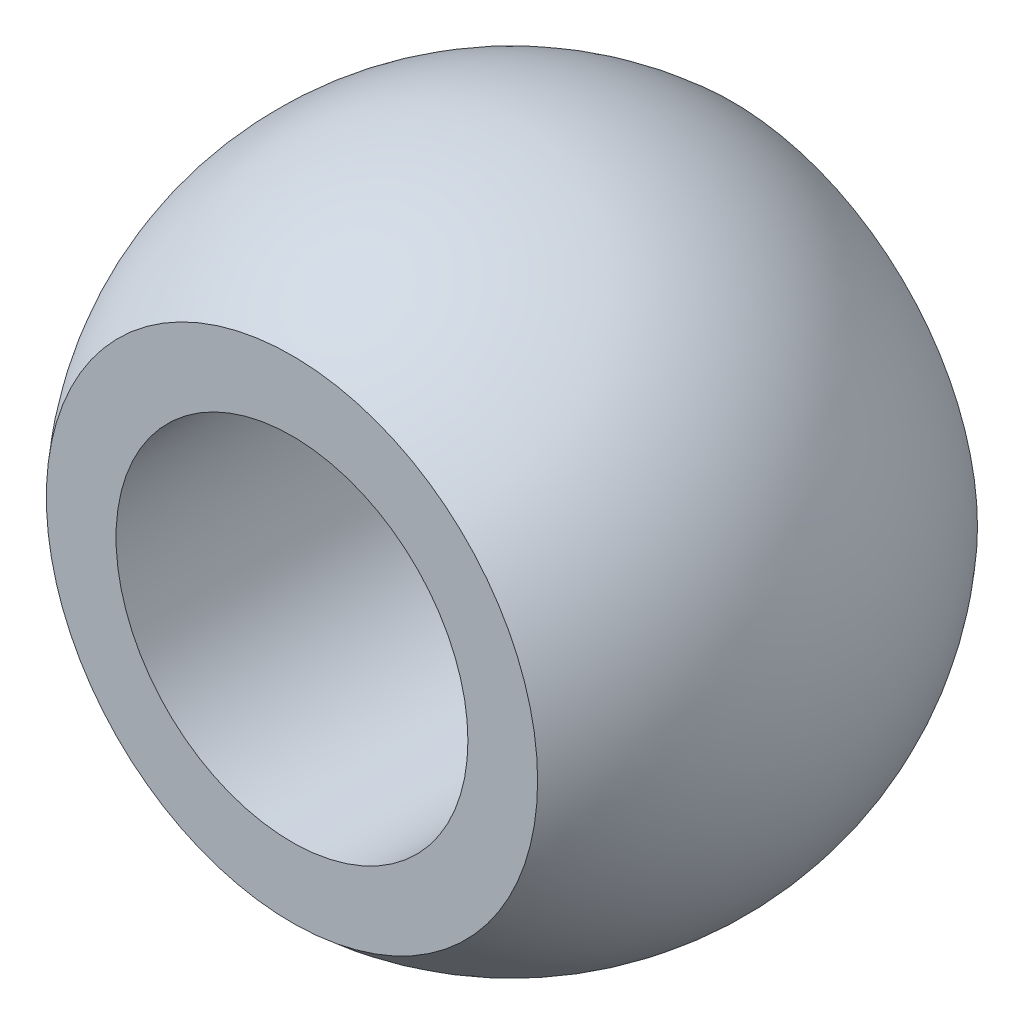
ISO-10303-21;
HEADER;
FILE_DESCRIPTION(('STEP AP214'),'2;1');
FILE_NAME('part.step','',(''),(''),'','','');
FILE_SCHEMA(('AUTOMOTIVE_DESIGN { 1 0 10303 214 1 1 1 1 }'));
ENDSEC;
DATA;
#1=APPLICATION_CONTEXT('core data for automotive mechanical design processes');
#2=APPLICATION_PROTOCOL_DEFINITION('international standard','automotive_design',2000,#1);
#3=PRODUCT_CONTEXT('',#1,'mechanical');
#4=PRODUCT('Part','Part','',(#3));
#5=PRODUCT_RELATED_PRODUCT_CATEGORY('part','',(#4));
#6=PRODUCT_DEFINITION_FORMATION('','',#4);
#7=PRODUCT_DEFINITION_CONTEXT('part definition',#1,'design');
#8=PRODUCT_DEFINITION('design','',#6,#7);
#9=PRODUCT_DEFINITION_SHAPE('','',#8);
#10=(LENGTH_UNIT() NAMED_UNIT(*) SI_UNIT(.MILLI.,.METRE.));
#11=(NAMED_UNIT(*) PLANE_ANGLE_UNIT() SI_UNIT($,.RADIAN.));
#12=(NAMED_UNIT(*) SI_UNIT($,.STERADIAN.) SOLID_ANGLE_UNIT());
#13=UNCERTAINTY_MEASURE_WITH_UNIT(LENGTH_MEASURE(1.E-05),#10,'distance_accuracy_value','');
#14=(GEOMETRIC_REPRESENTATION_CONTEXT(3) GLOBAL_UNCERTAINTY_ASSIGNED_CONTEXT((#13)) GLOBAL_UNIT_ASSIGNED_CONTEXT((#10,
#11,#12)) REPRESENTATION_CONTEXT('',''));
#15=CARTESIAN_POINT('',(0.,0.,0.));
#16=DIRECTION('',(0.,0.,1.));
#17=DIRECTION('',(1.,0.,0.));
#18=AXIS2_PLACEMENT_3D('',#15,#16,#17);
#19=CARTESIAN_POINT('',(0.,0.,0.));
#20=DIRECTION('',(0.,-1.,0.));
#21=DIRECTION('',(-1.,0.,0.));
#22=AXIS2_PLACEMENT_3D('',#19,#20,#21);
#23=SPHERICAL_SURFACE('',#22,11.8999);
#24=CARTESIAN_POINT('',(0.,0.,0.));
#25=DIRECTION('',(0.,0.,1.));
#26=DIRECTION('',(1.,0.,0.));
#27=AXIS2_PLACEMENT_3D('',#24,#25,#26);
#28=SPHERICAL_SURFACE('',#27,11.8999);
#29=CARTESIAN_POINT('',(0.,0.,7.9375));
#30=DIRECTION('',(0.,0.,1.));
#31=DIRECTION('',(1.,0.,0.));
#32=AXIS2_PLACEMENT_3D('',#29,#30,#31);
#33=CIRCLE('',#32,8.86587354748532);
#34=CARTESIAN_POINT('',(8.86587354748532,0.,7.9375));
#35=VERTEX_POINT('',#34);
#36=EDGE_CURVE('E10',#35,#35,#33,.T.);
#37=ORIENTED_EDGE('',*,*,#36,.F.);
#38=EDGE_LOOP('',(#37));
#39=FACE_BOUND('',#38,.T.);
#40=CARTESIAN_POINT('',(0.,0.,-7.9375));
#41=DIRECTION('',(0.,0.,-1.));
#42=DIRECTION('',(-1.,0.,0.));
#43=AXIS2_PLACEMENT_3D('',#40,#41,#42);
#44=CIRCLE('',#43,8.86587354748532);
#45=CARTESIAN_POINT('',(-8.86587354748532,0.,-7.9375));
#46=VERTEX_POINT('',#45);
#47=EDGE_CURVE('E39',#46,#46,#44,.T.);
#48=ORIENTED_EDGE('',*,*,#47,.F.);
#49=EDGE_LOOP('',(#48));
#50=FACE_BOUND('',#49,.T.);
#51=ADVANCED_FACE('F29',(#39,#50),#28,.T.);
#52=CARTESIAN_POINT('',(0.,0.,-25.4));
#53=DIRECTION('',(0.,0.,1.));
#54=DIRECTION('',(1.,0.,0.));
#55=AXIS2_PLACEMENT_3D('',#52,#53,#54);
#56=CYLINDRICAL_SURFACE('',#55,6.35);
#57=CARTESIAN_POINT('',(0.,0.,7.9375));
#58=DIRECTION('',(0.,0.,1.));
#59=DIRECTION('',(1.,0.,0.));
#60=AXIS2_PLACEMENT_3D('',#57,#58,#59);
#61=CIRCLE('',#60,6.35);
#62=CARTESIAN_POINT('',(6.35,0.,7.9375));
#63=VERTEX_POINT('',#62);
#64=EDGE_CURVE('E35',#63,#63,#61,.T.);
#65=ORIENTED_EDGE('',*,*,#64,.T.);
#66=EDGE_LOOP('',(#65));
#67=FACE_BOUND('',#66,.T.);
#68=CARTESIAN_POINT('',(0.,0.,-7.9375));
#69=DIRECTION('',(0.,0.,-1.));
#70=DIRECTION('',(-1.,0.,0.));
#71=AXIS2_PLACEMENT_3D('',#68,#69,#70);
#72=CIRCLE('',#71,6.35);
#73=CARTESIAN_POINT('',(-6.35,0.,-7.9375));
#74=VERTEX_POINT('',#73);
#75=EDGE_CURVE('E43',#74,#74,#72,.T.);
#76=ORIENTED_EDGE('',*,*,#75,.T.);
#77=EDGE_LOOP('',(#76));
#78=FACE_BOUND('',#77,.T.);
#79=ADVANCED_FACE('F49',(#67,#78),#56,.F.);
#80=CARTESIAN_POINT('',(0.,0.,7.9375));
#81=DIRECTION('',(0.,0.,1.));
#82=DIRECTION('',(1.,0.,0.));
#83=AXIS2_PLACEMENT_3D('',#80,#81,#82);
#84=PLANE('',#83);
#85=ORIENTED_EDGE('',*,*,#36,.T.);
#86=EDGE_LOOP('',(#85));
#87=FACE_BOUND('',#86,.T.);
#88=ORIENTED_EDGE('',*,*,#64,.F.);
#89=EDGE_LOOP('',(#88));
#90=FACE_BOUND('',#89,.T.);
#91=ADVANCED_FACE('F53',(#87,#90),#84,.T.);
#92=CARTESIAN_POINT('',(0.,0.,-7.9375));
#93=DIRECTION('',(0.,0.,-1.));
#94=DIRECTION('',(1.,0.,0.));
#95=AXIS2_PLACEMENT_3D('',#92,#93,#94);
#96=PLANE('',#95);
#97=ORIENTED_EDGE('',*,*,#47,.T.);
#98=EDGE_LOOP('',(#97));
#99=FACE_BOUND('',#98,.T.);
#100=ORIENTED_EDGE('',*,*,#75,.F.);
#101=EDGE_LOOP('',(#100));
#102=FACE_BOUND('',#101,.T.);
#103=ADVANCED_FACE('F51',(#99,#102),#96,.T.);
#104=CLOSED_SHELL('',(#51,#79,#91,#103));
#105=MANIFOLD_SOLID_BREP('B2',#104);
#106=ADVANCED_BREP_SHAPE_REPRESENTATION('',(#18,#105),#14);
#107=SHAPE_DEFINITION_REPRESENTATION(#9,#106);
ENDSEC;
END-ISO-10303-21;
